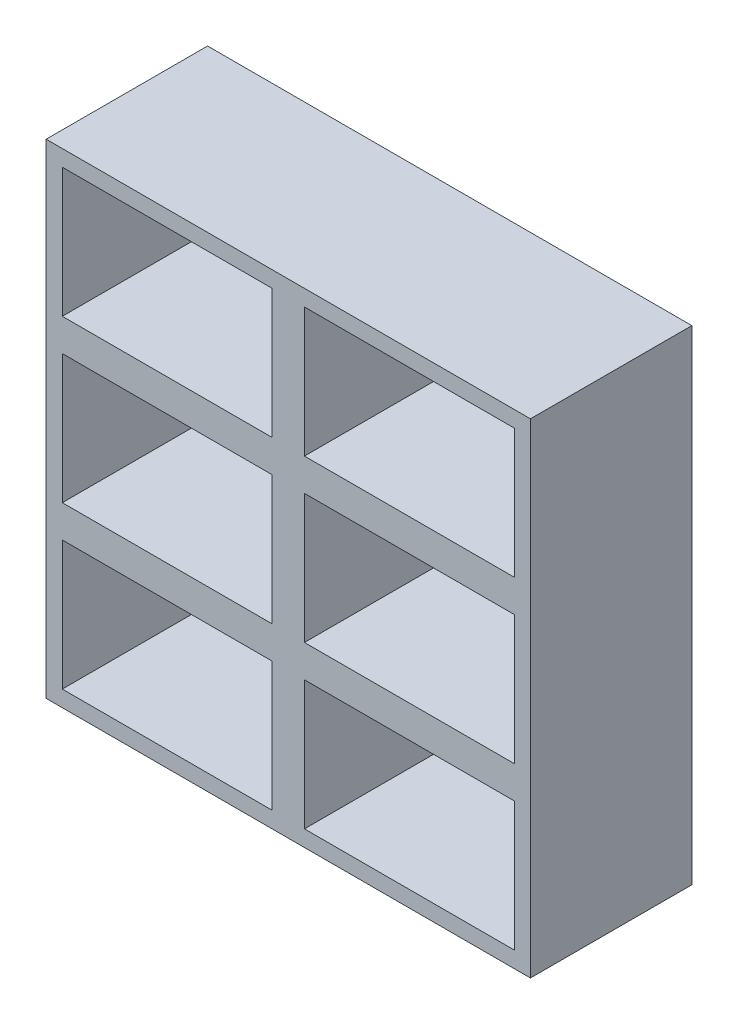
ISO-10303-21;
HEADER;
FILE_DESCRIPTION(('STEP AP214'),'2;1');
FILE_NAME('part.step','',(''),(''),'','','');
FILE_SCHEMA(('AUTOMOTIVE_DESIGN { 1 0 10303 214 1 1 1 1 }'));
ENDSEC;
DATA;
#1=APPLICATION_CONTEXT('core data for automotive mechanical design processes');
#2=APPLICATION_PROTOCOL_DEFINITION('international standard','automotive_design',2000,#1);
#3=PRODUCT_CONTEXT('',#1,'mechanical');
#4=PRODUCT('Part','Part','',(#3));
#5=PRODUCT_RELATED_PRODUCT_CATEGORY('part','',(#4));
#6=PRODUCT_DEFINITION_FORMATION('','',#4);
#7=PRODUCT_DEFINITION_CONTEXT('part definition',#1,'design');
#8=PRODUCT_DEFINITION('design','',#6,#7);
#9=PRODUCT_DEFINITION_SHAPE('','',#8);
#10=(LENGTH_UNIT() NAMED_UNIT(*) SI_UNIT(.MILLI.,.METRE.));
#11=(NAMED_UNIT(*) PLANE_ANGLE_UNIT() SI_UNIT($,.RADIAN.));
#12=(NAMED_UNIT(*) SI_UNIT($,.STERADIAN.) SOLID_ANGLE_UNIT());
#13=UNCERTAINTY_MEASURE_WITH_UNIT(LENGTH_MEASURE(1.E-05),#10,'distance_accuracy_value','');
#14=(GEOMETRIC_REPRESENTATION_CONTEXT(3) GLOBAL_UNCERTAINTY_ASSIGNED_CONTEXT((#13)) GLOBAL_UNIT_ASSIGNED_CONTEXT((#10,
#11,#12)) REPRESENTATION_CONTEXT('',''));
#15=CARTESIAN_POINT('',(0.,0.,0.));
#16=DIRECTION('',(0.,0.,1.));
#17=DIRECTION('',(1.,0.,0.));
#18=AXIS2_PLACEMENT_3D('',#15,#16,#17);
#19=CARTESIAN_POINT('',(0.,0.,-20.));
#20=DIRECTION('',(-1.,0.,0.));
#21=DIRECTION('',(0.,0.,1.));
#22=AXIS2_PLACEMENT_3D('',#19,#20,#21);
#23=PLANE('',#22);
#24=DIRECTION('',(0.,-1.,0.));
#25=VECTOR('',#24,1.);
#26=CARTESIAN_POINT('',(0.,0.,0.));
#27=LINE('',#26,#25);
#28=CARTESIAN_POINT('',(0.,60.,0.));
#29=VERTEX_POINT('',#28);
#30=CARTESIAN_POINT('',(0.,0.,0.));
#31=VERTEX_POINT('',#30);
#32=EDGE_CURVE('E412',#29,#31,#27,.T.);
#33=ORIENTED_EDGE('',*,*,#32,.F.);
#34=DIRECTION('',(0.,0.,1.));
#35=VECTOR('',#34,1.);
#36=CARTESIAN_POINT('',(0.,60.,-20.));
#37=LINE('',#36,#35);
#38=CARTESIAN_POINT('',(0.,60.,-20.));
#39=VERTEX_POINT('',#38);
#40=EDGE_CURVE('E11',#39,#29,#37,.T.);
#41=ORIENTED_EDGE('',*,*,#40,.F.);
#42=DIRECTION('',(0.,-1.,0.));
#43=VECTOR('',#42,1.);
#44=CARTESIAN_POINT('',(0.,0.,-20.));
#45=LINE('',#44,#43);
#46=CARTESIAN_POINT('',(0.,0.,-20.));
#47=VERTEX_POINT('',#46);
#48=EDGE_CURVE('E419',#39,#47,#45,.T.);
#49=ORIENTED_EDGE('',*,*,#48,.T.);
#50=DIRECTION('',(0.,0.,1.));
#51=VECTOR('',#50,1.);
#52=CARTESIAN_POINT('',(0.,0.,-20.));
#53=LINE('',#52,#51);
#54=EDGE_CURVE('E38',#47,#31,#53,.T.);
#55=ORIENTED_EDGE('',*,*,#54,.T.);
#56=EDGE_LOOP('',(#33,#41,#49,#55));
#57=FACE_BOUND('',#56,.T.);
#58=ADVANCED_FACE('F35',(#57),#23,.T.);
#59=CARTESIAN_POINT('',(0.,60.,-20.));
#60=DIRECTION('',(0.,1.,0.));
#61=DIRECTION('',(0.,0.,1.));
#62=AXIS2_PLACEMENT_3D('',#59,#60,#61);
#63=PLANE('',#62);
#64=DIRECTION('',(-1.,0.,0.));
#65=VECTOR('',#64,1.);
#66=CARTESIAN_POINT('',(0.,60.,0.));
#67=LINE('',#66,#65);
#68=CARTESIAN_POINT('',(60.,60.,0.));
#69=VERTEX_POINT('',#68);
#70=EDGE_CURVE('E423',#69,#29,#67,.T.);
#71=ORIENTED_EDGE('',*,*,#70,.F.);
#72=DIRECTION('',(0.,0.,1.));
#73=VECTOR('',#72,1.);
#74=CARTESIAN_POINT('',(60.,60.,-20.));
#75=LINE('',#74,#73);
#76=CARTESIAN_POINT('',(60.,60.,-20.));
#77=VERTEX_POINT('',#76);
#78=EDGE_CURVE('E43',#77,#69,#75,.T.);
#79=ORIENTED_EDGE('',*,*,#78,.F.);
#80=DIRECTION('',(-1.,0.,0.));
#81=VECTOR('',#80,1.);
#82=CARTESIAN_POINT('',(0.,60.,-20.));
#83=LINE('',#82,#81);
#84=EDGE_CURVE('E429',#77,#39,#83,.T.);
#85=ORIENTED_EDGE('',*,*,#84,.T.);
#86=ORIENTED_EDGE('',*,*,#40,.T.);
#87=EDGE_LOOP('',(#71,#79,#85,#86));
#88=FACE_BOUND('',#87,.T.);
#89=ADVANCED_FACE('F455',(#88),#63,.T.);
#90=CARTESIAN_POINT('',(60.,0.,-20.));
#91=DIRECTION('',(1.,0.,0.));
#92=DIRECTION('',(0.,0.,-1.));
#93=AXIS2_PLACEMENT_3D('',#90,#91,#92);
#94=PLANE('',#93);
#95=DIRECTION('',(0.,1.,0.));
#96=VECTOR('',#95,1.);
#97=CARTESIAN_POINT('',(60.,0.,0.));
#98=LINE('',#97,#96);
#99=CARTESIAN_POINT('',(60.,0.,0.));
#100=VERTEX_POINT('',#99);
#101=EDGE_CURVE('E437',#100,#69,#98,.T.);
#102=ORIENTED_EDGE('',*,*,#101,.F.);
#103=DIRECTION('',(0.,0.,1.));
#104=VECTOR('',#103,1.);
#105=CARTESIAN_POINT('',(60.,0.,-20.));
#106=LINE('',#105,#104);
#107=CARTESIAN_POINT('',(60.,0.,-20.));
#108=VERTEX_POINT('',#107);
#109=EDGE_CURVE('E442',#108,#100,#106,.T.);
#110=ORIENTED_EDGE('',*,*,#109,.F.);
#111=DIRECTION('',(0.,1.,0.));
#112=VECTOR('',#111,1.);
#113=CARTESIAN_POINT('',(60.,0.,-20.));
#114=LINE('',#113,#112);
#115=EDGE_CURVE('E426',#108,#77,#114,.T.);
#116=ORIENTED_EDGE('',*,*,#115,.T.);
#117=ORIENTED_EDGE('',*,*,#78,.T.);
#118=EDGE_LOOP('',(#102,#110,#116,#117));
#119=FACE_BOUND('',#118,.T.);
#120=ADVANCED_FACE('F461',(#119),#94,.T.);
#121=CARTESIAN_POINT('',(0.,0.,-20.));
#122=DIRECTION('',(0.,-1.,0.));
#123=DIRECTION('',(0.,0.,-1.));
#124=AXIS2_PLACEMENT_3D('',#121,#122,#123);
#125=PLANE('',#124);
#126=DIRECTION('',(1.,0.,0.));
#127=VECTOR('',#126,1.);
#128=CARTESIAN_POINT('',(0.,0.,0.));
#129=LINE('',#128,#127);
#130=EDGE_CURVE('E434',#31,#100,#129,.T.);
#131=ORIENTED_EDGE('',*,*,#130,.F.);
#132=ORIENTED_EDGE('',*,*,#54,.F.);
#133=DIRECTION('',(1.,0.,0.));
#134=VECTOR('',#133,1.);
#135=CARTESIAN_POINT('',(0.,0.,-20.));
#136=LINE('',#135,#134);
#137=EDGE_CURVE('E422',#47,#108,#136,.T.);
#138=ORIENTED_EDGE('',*,*,#137,.T.);
#139=ORIENTED_EDGE('',*,*,#109,.T.);
#140=EDGE_LOOP('',(#131,#132,#138,#139));
#141=FACE_BOUND('',#140,.T.);
#142=ADVANCED_FACE('F450',(#141),#125,.T.);
#143=CARTESIAN_POINT('',(0.,0.,-20.));
#144=DIRECTION('',(0.,0.,-1.));
#145=DIRECTION('',(-1.,0.,0.));
#146=AXIS2_PLACEMENT_3D('',#143,#144,#145);
#147=PLANE('',#146);
#148=ORIENTED_EDGE('',*,*,#48,.F.);
#149=ORIENTED_EDGE('',*,*,#84,.F.);
#150=ORIENTED_EDGE('',*,*,#115,.F.);
#151=ORIENTED_EDGE('',*,*,#137,.F.);
#152=EDGE_LOOP('',(#148,#149,#150,#151));
#153=FACE_BOUND('',#152,.T.);
#154=ADVANCED_FACE('F458',(#153),#147,.T.);
#155=CARTESIAN_POINT('',(0.,0.,0.));
#156=DIRECTION('',(0.,0.,-1.));
#157=DIRECTION('',(-1.,0.,0.));
#158=AXIS2_PLACEMENT_3D('',#155,#156,#157);
#159=PLANE('',#158);
#160=DIRECTION('',(0.,1.,0.));
#161=VECTOR('',#160,1.);
#162=CARTESIAN_POINT('',(28.,2.,0.));
#163=LINE('',#162,#161);
#164=CARTESIAN_POINT('',(28.,2.,0.));
#165=VERTEX_POINT('',#164);
#166=CARTESIAN_POINT('',(28.,18.,0.));
#167=VERTEX_POINT('',#166);
#168=EDGE_CURVE('E309',#165,#167,#163,.T.);
#169=ORIENTED_EDGE('',*,*,#168,.F.);
#170=DIRECTION('',(1.,0.,0.));
#171=VECTOR('',#170,1.);
#172=CARTESIAN_POINT('',(2.,2.,0.));
#173=LINE('',#172,#171);
#174=CARTESIAN_POINT('',(2.,2.,0.));
#175=VERTEX_POINT('',#174);
#176=EDGE_CURVE('E51',#175,#165,#173,.T.);
#177=ORIENTED_EDGE('',*,*,#176,.F.);
#178=DIRECTION('',(0.,-1.,0.));
#179=VECTOR('',#178,1.);
#180=CARTESIAN_POINT('',(2.,18.,0.));
#181=LINE('',#180,#179);
#182=CARTESIAN_POINT('',(2.,18.,0.));
#183=VERTEX_POINT('',#182);
#184=EDGE_CURVE('E298',#183,#175,#181,.T.);
#185=ORIENTED_EDGE('',*,*,#184,.F.);
#186=DIRECTION('',(-1.,0.,0.));
#187=VECTOR('',#186,1.);
#188=CARTESIAN_POINT('',(2.,18.,0.));
#189=LINE('',#188,#187);
#190=EDGE_CURVE('E312',#167,#183,#189,.T.);
#191=ORIENTED_EDGE('',*,*,#190,.F.);
#192=EDGE_LOOP('',(#169,#177,#185,#191));
#193=FACE_BOUND('',#192,.T.);
#194=DIRECTION('',(-1.,0.,0.));
#195=VECTOR('',#194,1.);
#196=CARTESIAN_POINT('',(58.,38.,0.));
#197=LINE('',#196,#195);
#198=CARTESIAN_POINT('',(58.,38.,0.));
#199=VERTEX_POINT('',#198);
#200=CARTESIAN_POINT('',(32.,38.,0.));
#201=VERTEX_POINT('',#200);
#202=EDGE_CURVE('E277',#199,#201,#197,.T.);
#203=ORIENTED_EDGE('',*,*,#202,.F.);
#204=DIRECTION('',(0.,1.,0.));
#205=VECTOR('',#204,1.);
#206=CARTESIAN_POINT('',(58.,22.,0.));
#207=LINE('',#206,#205);
#208=CARTESIAN_POINT('',(58.,22.,0.));
#209=VERTEX_POINT('',#208);
#210=EDGE_CURVE('E59',#209,#199,#207,.T.);
#211=ORIENTED_EDGE('',*,*,#210,.F.);
#212=DIRECTION('',(1.,0.,0.));
#213=VECTOR('',#212,1.);
#214=CARTESIAN_POINT('',(32.,22.,0.));
#215=LINE('',#214,#213);
#216=CARTESIAN_POINT('',(32.,22.,0.));
#217=VERTEX_POINT('',#216);
#218=EDGE_CURVE('E266',#217,#209,#215,.T.);
#219=ORIENTED_EDGE('',*,*,#218,.F.);
#220=DIRECTION('',(0.,-1.,0.));
#221=VECTOR('',#220,1.);
#222=CARTESIAN_POINT('',(32.,38.,0.));
#223=LINE('',#222,#221);
#224=EDGE_CURVE('E281',#201,#217,#223,.T.);
#225=ORIENTED_EDGE('',*,*,#224,.F.);
#226=EDGE_LOOP('',(#203,#211,#219,#225));
#227=FACE_BOUND('',#226,.T.);
#228=DIRECTION('',(0.,-1.,0.));
#229=VECTOR('',#228,1.);
#230=CARTESIAN_POINT('',(2.,38.,0.));
#231=LINE('',#230,#229);
#232=CARTESIAN_POINT('',(2.,38.,0.));
#233=VERTEX_POINT('',#232);
#234=CARTESIAN_POINT('',(2.,22.,0.));
#235=VERTEX_POINT('',#234);
#236=EDGE_CURVE('E372',#233,#235,#231,.T.);
#237=ORIENTED_EDGE('',*,*,#236,.F.);
#238=DIRECTION('',(-1.,0.,0.));
#239=VECTOR('',#238,1.);
#240=CARTESIAN_POINT('',(2.,38.,0.));
#241=LINE('',#240,#239);
#242=CARTESIAN_POINT('',(28.,38.,0.));
#243=VERTEX_POINT('',#242);
#244=EDGE_CURVE('E288',#243,#233,#241,.T.);
#245=ORIENTED_EDGE('',*,*,#244,.F.);
#246=DIRECTION('',(0.,1.,0.));
#247=VECTOR('',#246,1.);
#248=CARTESIAN_POINT('',(28.,38.,0.));
#249=LINE('',#248,#247);
#250=CARTESIAN_POINT('',(28.,22.,0.));
#251=VERTEX_POINT('',#250);
#252=EDGE_CURVE('E361',#251,#243,#249,.T.);
#253=ORIENTED_EDGE('',*,*,#252,.F.);
#254=DIRECTION('',(1.,0.,0.));
#255=VECTOR('',#254,1.);
#256=CARTESIAN_POINT('',(28.,22.,0.));
#257=LINE('',#256,#255);
#258=EDGE_CURVE('E375',#235,#251,#257,.T.);
#259=ORIENTED_EDGE('',*,*,#258,.F.);
#260=EDGE_LOOP('',(#237,#245,#253,#259));
#261=FACE_BOUND('',#260,.T.);
#262=DIRECTION('',(1.,0.,0.));
#263=VECTOR('',#262,1.);
#264=CARTESIAN_POINT('',(32.,42.,0.));
#265=LINE('',#264,#263);
#266=CARTESIAN_POINT('',(32.,42.,0.));
#267=VERTEX_POINT('',#266);
#268=CARTESIAN_POINT('',(58.,42.,0.));
#269=VERTEX_POINT('',#268);
#270=EDGE_CURVE('E339',#267,#269,#265,.T.);
#271=ORIENTED_EDGE('',*,*,#270,.F.);
#272=DIRECTION('',(0.,-1.,0.));
#273=VECTOR('',#272,1.);
#274=CARTESIAN_POINT('',(32.,58.,0.));
#275=LINE('',#274,#273);
#276=CARTESIAN_POINT('',(32.,58.,0.));
#277=VERTEX_POINT('',#276);
#278=EDGE_CURVE('E337',#277,#267,#275,.T.);
#279=ORIENTED_EDGE('',*,*,#278,.F.);
#280=DIRECTION('',(-1.,0.,0.));
#281=VECTOR('',#280,1.);
#282=CARTESIAN_POINT('',(32.,58.,0.));
#283=LINE('',#282,#281);
#284=CARTESIAN_POINT('',(58.,58.,0.));
#285=VERTEX_POINT('',#284);
#286=EDGE_CURVE('E327',#285,#277,#283,.T.);
#287=ORIENTED_EDGE('',*,*,#286,.F.);
#288=DIRECTION('',(0.,1.,0.));
#289=VECTOR('',#288,1.);
#290=CARTESIAN_POINT('',(58.,58.,0.));
#291=LINE('',#290,#289);
#292=EDGE_CURVE('E343',#269,#285,#291,.T.);
#293=ORIENTED_EDGE('',*,*,#292,.F.);
#294=EDGE_LOOP('',(#271,#279,#287,#293));
#295=FACE_BOUND('',#294,.T.);
#296=DIRECTION('',(1.,0.,0.));
#297=VECTOR('',#296,1.);
#298=CARTESIAN_POINT('',(32.,2.,0.));
#299=LINE('',#298,#297);
#300=CARTESIAN_POINT('',(32.,2.,0.));
#301=VERTEX_POINT('',#300);
#302=CARTESIAN_POINT('',(58.,2.,0.));
#303=VERTEX_POINT('',#302);
#304=EDGE_CURVE('E253',#301,#303,#299,.T.);
#305=ORIENTED_EDGE('',*,*,#304,.F.);
#306=DIRECTION('',(0.,-1.,0.));
#307=VECTOR('',#306,1.);
#308=CARTESIAN_POINT('',(32.,2.,0.));
#309=LINE('',#308,#307);
#310=CARTESIAN_POINT('',(32.,18.,0.));
#311=VERTEX_POINT('',#310);
#312=EDGE_CURVE('E227',#311,#301,#309,.T.);
#313=ORIENTED_EDGE('',*,*,#312,.F.);
#314=DIRECTION('',(-1.,0.,0.));
#315=VECTOR('',#314,1.);
#316=CARTESIAN_POINT('',(32.,18.,0.));
#317=LINE('',#316,#315);
#318=CARTESIAN_POINT('',(58.,18.,0.));
#319=VERTEX_POINT('',#318);
#320=EDGE_CURVE('E244',#319,#311,#317,.T.);
#321=ORIENTED_EDGE('',*,*,#320,.F.);
#322=DIRECTION('',(0.,1.,0.));
#323=VECTOR('',#322,1.);
#324=CARTESIAN_POINT('',(58.,2.,0.));
#325=LINE('',#324,#323);
#326=EDGE_CURVE('E247',#303,#319,#325,.T.);
#327=ORIENTED_EDGE('',*,*,#326,.F.);
#328=EDGE_LOOP('',(#305,#313,#321,#327));
#329=FACE_BOUND('',#328,.T.);
#330=DIRECTION('',(0.,-1.,0.));
#331=VECTOR('',#330,1.);
#332=CARTESIAN_POINT('',(2.,58.,0.));
#333=LINE('',#332,#331);
#334=CARTESIAN_POINT('',(2.,58.,0.));
#335=VERTEX_POINT('',#334);
#336=CARTESIAN_POINT('',(2.,42.,0.));
#337=VERTEX_POINT('',#336);
#338=EDGE_CURVE('E402',#335,#337,#333,.T.);
#339=ORIENTED_EDGE('',*,*,#338,.F.);
#340=DIRECTION('',(-1.,0.,0.));
#341=VECTOR('',#340,1.);
#342=CARTESIAN_POINT('',(2.,58.,0.));
#343=LINE('',#342,#341);
#344=CARTESIAN_POINT('',(28.,58.,0.));
#345=VERTEX_POINT('',#344);
#346=EDGE_CURVE('E350',#345,#335,#343,.T.);
#347=ORIENTED_EDGE('',*,*,#346,.F.);
#348=DIRECTION('',(0.,1.,0.));
#349=VECTOR('',#348,1.);
#350=CARTESIAN_POINT('',(28.,58.,0.));
#351=LINE('',#350,#349);
#352=CARTESIAN_POINT('',(28.,42.,0.));
#353=VERTEX_POINT('',#352);
#354=EDGE_CURVE('E391',#353,#345,#351,.T.);
#355=ORIENTED_EDGE('',*,*,#354,.F.);
#356=DIRECTION('',(1.,0.,0.));
#357=VECTOR('',#356,1.);
#358=CARTESIAN_POINT('',(28.,42.,0.));
#359=LINE('',#358,#357);
#360=EDGE_CURVE('E405',#337,#353,#359,.T.);
#361=ORIENTED_EDGE('',*,*,#360,.F.);
#362=EDGE_LOOP('',(#339,#347,#355,#361));
#363=FACE_BOUND('',#362,.T.);
#364=ORIENTED_EDGE('',*,*,#32,.T.);
#365=ORIENTED_EDGE('',*,*,#130,.T.);
#366=ORIENTED_EDGE('',*,*,#101,.T.);
#367=ORIENTED_EDGE('',*,*,#70,.T.);
#368=EDGE_LOOP('',(#364,#365,#366,#367));
#369=FACE_BOUND('',#368,.T.);
#370=ADVANCED_FACE('F452',(#193,#227,#261,#295,#329,#363,#369),#159,.F.);
#371=CARTESIAN_POINT('',(2.,58.,-18.));
#372=DIRECTION('',(0.,1.,0.));
#373=DIRECTION('',(-1.,0.,0.));
#374=AXIS2_PLACEMENT_3D('',#371,#372,#373);
#375=PLANE('',#374);
#376=ORIENTED_EDGE('',*,*,#346,.T.);
#377=DIRECTION('',(0.,0.,1.));
#378=VECTOR('',#377,1.);
#379=CARTESIAN_POINT('',(2.,58.,-18.));
#380=LINE('',#379,#378);
#381=CARTESIAN_POINT('',(2.,58.,-18.));
#382=VERTEX_POINT('',#381);
#383=EDGE_CURVE('E400',#382,#335,#380,.T.);
#384=ORIENTED_EDGE('',*,*,#383,.F.);
#385=DIRECTION('',(-1.,0.,0.));
#386=VECTOR('',#385,1.);
#387=CARTESIAN_POINT('',(2.,58.,-18.));
#388=LINE('',#387,#386);
#389=CARTESIAN_POINT('',(28.,58.,-18.));
#390=VERTEX_POINT('',#389);
#391=EDGE_CURVE('E387',#390,#382,#388,.T.);
#392=ORIENTED_EDGE('',*,*,#391,.F.);
#393=DIRECTION('',(0.,0.,1.));
#394=VECTOR('',#393,1.);
#395=CARTESIAN_POINT('',(28.,58.,-18.));
#396=LINE('',#395,#394);
#397=EDGE_CURVE('E410',#390,#345,#396,.T.);
#398=ORIENTED_EDGE('',*,*,#397,.T.);
#399=EDGE_LOOP('',(#376,#384,#392,#398));
#400=FACE_BOUND('',#399,.T.);
#401=ADVANCED_FACE('F503',(#400),#375,.F.);
#402=CARTESIAN_POINT('',(28.,58.,-18.));
#403=DIRECTION('',(1.,0.,0.));
#404=DIRECTION('',(0.,1.,0.));
#405=AXIS2_PLACEMENT_3D('',#402,#403,#404);
#406=PLANE('',#405);
#407=ORIENTED_EDGE('',*,*,#354,.T.);
#408=ORIENTED_EDGE('',*,*,#397,.F.);
#409=DIRECTION('',(0.,1.,0.));
#410=VECTOR('',#409,1.);
#411=CARTESIAN_POINT('',(28.,58.,-18.));
#412=LINE('',#411,#410);
#413=CARTESIAN_POINT('',(28.,42.,-18.));
#414=VERTEX_POINT('',#413);
#415=EDGE_CURVE('E397',#414,#390,#412,.T.);
#416=ORIENTED_EDGE('',*,*,#415,.F.);
#417=DIRECTION('',(0.,0.,1.));
#418=VECTOR('',#417,1.);
#419=CARTESIAN_POINT('',(28.,42.,-18.));
#420=LINE('',#419,#418);
#421=EDGE_CURVE('E413',#414,#353,#420,.T.);
#422=ORIENTED_EDGE('',*,*,#421,.T.);
#423=EDGE_LOOP('',(#407,#408,#416,#422));
#424=FACE_BOUND('',#423,.T.);
#425=ADVANCED_FACE('F513',(#424),#406,.F.);
#426=CARTESIAN_POINT('',(28.,42.,-18.));
#427=DIRECTION('',(0.,-1.,0.));
#428=DIRECTION('',(1.,0.,0.));
#429=AXIS2_PLACEMENT_3D('',#426,#427,#428);
#430=PLANE('',#429);
#431=ORIENTED_EDGE('',*,*,#360,.T.);
#432=ORIENTED_EDGE('',*,*,#421,.F.);
#433=DIRECTION('',(1.,0.,0.));
#434=VECTOR('',#433,1.);
#435=CARTESIAN_POINT('',(28.,42.,-18.));
#436=LINE('',#435,#434);
#437=CARTESIAN_POINT('',(2.,42.,-18.));
#438=VERTEX_POINT('',#437);
#439=EDGE_CURVE('E394',#438,#414,#436,.T.);
#440=ORIENTED_EDGE('',*,*,#439,.F.);
#441=DIRECTION('',(0.,0.,1.));
#442=VECTOR('',#441,1.);
#443=CARTESIAN_POINT('',(2.,42.,-18.));
#444=LINE('',#443,#442);
#445=EDGE_CURVE('E415',#438,#337,#444,.T.);
#446=ORIENTED_EDGE('',*,*,#445,.T.);
#447=EDGE_LOOP('',(#431,#432,#440,#446));
#448=FACE_BOUND('',#447,.T.);
#449=ADVANCED_FACE('F523',(#448),#430,.F.);
#450=CARTESIAN_POINT('',(2.,58.,-18.));
#451=DIRECTION('',(-1.,0.,0.));
#452=DIRECTION('',(0.,-1.,0.));
#453=AXIS2_PLACEMENT_3D('',#450,#451,#452);
#454=PLANE('',#453);
#455=ORIENTED_EDGE('',*,*,#338,.T.);
#456=ORIENTED_EDGE('',*,*,#445,.F.);
#457=DIRECTION('',(0.,-1.,0.));
#458=VECTOR('',#457,1.);
#459=CARTESIAN_POINT('',(2.,58.,-18.));
#460=LINE('',#459,#458);
#461=EDGE_CURVE('E390',#382,#438,#460,.T.);
#462=ORIENTED_EDGE('',*,*,#461,.F.);
#463=ORIENTED_EDGE('',*,*,#383,.T.);
#464=EDGE_LOOP('',(#455,#456,#462,#463));
#465=FACE_BOUND('',#464,.T.);
#466=ADVANCED_FACE('F533',(#465),#454,.F.);
#467=CARTESIAN_POINT('',(0.,0.,-18.));
#468=DIRECTION('',(0.,0.,-1.));
#469=DIRECTION('',(-1.,0.,0.));
#470=AXIS2_PLACEMENT_3D('',#467,#468,#469);
#471=PLANE('',#470);
#472=ORIENTED_EDGE('',*,*,#391,.T.);
#473=ORIENTED_EDGE('',*,*,#461,.T.);
#474=ORIENTED_EDGE('',*,*,#439,.T.);
#475=ORIENTED_EDGE('',*,*,#415,.T.);
#476=EDGE_LOOP('',(#472,#473,#474,#475));
#477=FACE_BOUND('',#476,.T.);
#478=ADVANCED_FACE('F543',(#477),#471,.F.);
#479=CARTESIAN_POINT('',(32.,2.,-18.));
#480=DIRECTION('',(-1.,0.,0.));
#481=DIRECTION('',(0.,0.,1.));
#482=AXIS2_PLACEMENT_3D('',#479,#480,#481);
#483=PLANE('',#482);
#484=ORIENTED_EDGE('',*,*,#312,.T.);
#485=DIRECTION('',(0.,0.,1.));
#486=VECTOR('',#485,1.);
#487=CARTESIAN_POINT('',(32.,2.,-18.));
#488=LINE('',#487,#486);
#489=CARTESIAN_POINT('',(32.,2.,-18.));
#490=VERTEX_POINT('',#489);
#491=EDGE_CURVE('E220',#490,#301,#488,.T.);
#492=ORIENTED_EDGE('',*,*,#491,.F.);
#493=DIRECTION('',(0.,-1.,0.));
#494=VECTOR('',#493,1.);
#495=CARTESIAN_POINT('',(32.,2.,-18.));
#496=LINE('',#495,#494);
#497=CARTESIAN_POINT('',(32.,18.,-18.));
#498=VERTEX_POINT('',#497);
#499=EDGE_CURVE('E224',#498,#490,#496,.T.);
#500=ORIENTED_EDGE('',*,*,#499,.F.);
#501=DIRECTION('',(0.,0.,1.));
#502=VECTOR('',#501,1.);
#503=CARTESIAN_POINT('',(32.,18.,-18.));
#504=LINE('',#503,#502);
#505=EDGE_CURVE('E257',#498,#311,#504,.T.);
#506=ORIENTED_EDGE('',*,*,#505,.T.);
#507=EDGE_LOOP('',(#484,#492,#500,#506));
#508=FACE_BOUND('',#507,.T.);
#509=ADVANCED_FACE('F222',(#508),#483,.F.);
#510=CARTESIAN_POINT('',(32.,18.,-18.));
#511=DIRECTION('',(0.,1.,0.));
#512=DIRECTION('',(0.,0.,1.));
#513=AXIS2_PLACEMENT_3D('',#510,#511,#512);
#514=PLANE('',#513);
#515=ORIENTED_EDGE('',*,*,#320,.T.);
#516=ORIENTED_EDGE('',*,*,#505,.F.);
#517=DIRECTION('',(-1.,0.,0.));
#518=VECTOR('',#517,1.);
#519=CARTESIAN_POINT('',(32.,18.,-18.));
#520=LINE('',#519,#518);
#521=CARTESIAN_POINT('',(58.,18.,-18.));
#522=VERTEX_POINT('',#521);
#523=EDGE_CURVE('E232',#522,#498,#520,.T.);
#524=ORIENTED_EDGE('',*,*,#523,.F.);
#525=DIRECTION('',(0.,0.,1.));
#526=VECTOR('',#525,1.);
#527=CARTESIAN_POINT('',(58.,18.,-18.));
#528=LINE('',#527,#526);
#529=EDGE_CURVE('E259',#522,#319,#528,.T.);
#530=ORIENTED_EDGE('',*,*,#529,.T.);
#531=EDGE_LOOP('',(#515,#516,#524,#530));
#532=FACE_BOUND('',#531,.T.);
#533=ADVANCED_FACE('F562',(#532),#514,.F.);
#534=CARTESIAN_POINT('',(58.,2.,-18.));
#535=DIRECTION('',(1.,0.,0.));
#536=DIRECTION('',(0.,0.,-1.));
#537=AXIS2_PLACEMENT_3D('',#534,#535,#536);
#538=PLANE('',#537);
#539=ORIENTED_EDGE('',*,*,#326,.T.);
#540=ORIENTED_EDGE('',*,*,#529,.F.);
#541=DIRECTION('',(0.,1.,0.));
#542=VECTOR('',#541,1.);
#543=CARTESIAN_POINT('',(58.,2.,-18.));
#544=LINE('',#543,#542);
#545=CARTESIAN_POINT('',(58.,2.,-18.));
#546=VERTEX_POINT('',#545);
#547=EDGE_CURVE('E240',#546,#522,#544,.T.);
#548=ORIENTED_EDGE('',*,*,#547,.F.);
#549=DIRECTION('',(0.,0.,1.));
#550=VECTOR('',#549,1.);
#551=CARTESIAN_POINT('',(58.,2.,-18.));
#552=LINE('',#551,#550);
#553=EDGE_CURVE('E231',#546,#303,#552,.T.);
#554=ORIENTED_EDGE('',*,*,#553,.T.);
#555=EDGE_LOOP('',(#539,#540,#548,#554));
#556=FACE_BOUND('',#555,.T.);
#557=ADVANCED_FACE('F571',(#556),#538,.F.);
#558=CARTESIAN_POINT('',(32.,2.,-18.));
#559=DIRECTION('',(0.,-1.,0.));
#560=DIRECTION('',(0.,0.,-1.));
#561=AXIS2_PLACEMENT_3D('',#558,#559,#560);
#562=PLANE('',#561);
#563=ORIENTED_EDGE('',*,*,#304,.T.);
#564=ORIENTED_EDGE('',*,*,#553,.F.);
#565=DIRECTION('',(1.,0.,0.));
#566=VECTOR('',#565,1.);
#567=CARTESIAN_POINT('',(32.,2.,-18.));
#568=LINE('',#567,#566);
#569=EDGE_CURVE('E235',#490,#546,#568,.T.);
#570=ORIENTED_EDGE('',*,*,#569,.F.);
#571=ORIENTED_EDGE('',*,*,#491,.T.);
#572=EDGE_LOOP('',(#563,#564,#570,#571));
#573=FACE_BOUND('',#572,.T.);
#574=ADVANCED_FACE('F236',(#573),#562,.F.);
#575=CARTESIAN_POINT('',(0.,0.,-18.));
#576=DIRECTION('',(0.,0.,-1.));
#577=DIRECTION('',(-1.,0.,0.));
#578=AXIS2_PLACEMENT_3D('',#575,#576,#577);
#579=PLANE('',#578);
#580=ORIENTED_EDGE('',*,*,#499,.T.);
#581=ORIENTED_EDGE('',*,*,#569,.T.);
#582=ORIENTED_EDGE('',*,*,#547,.T.);
#583=ORIENTED_EDGE('',*,*,#523,.T.);
#584=EDGE_LOOP('',(#580,#581,#582,#583));
#585=FACE_BOUND('',#584,.T.);
#586=ADVANCED_FACE('F242',(#585),#579,.F.);
#587=CARTESIAN_POINT('',(32.,58.,-18.));
#588=DIRECTION('',(-1.,0.,0.));
#589=DIRECTION('',(0.,0.,1.));
#590=AXIS2_PLACEMENT_3D('',#587,#588,#589);
#591=PLANE('',#590);
#592=ORIENTED_EDGE('',*,*,#278,.T.);
#593=DIRECTION('',(0.,0.,1.));
#594=VECTOR('',#593,1.);
#595=CARTESIAN_POINT('',(32.,42.,-18.));
#596=LINE('',#595,#594);
#597=CARTESIAN_POINT('',(32.,42.,-18.));
#598=VERTEX_POINT('',#597);
#599=EDGE_CURVE('E336',#598,#267,#596,.T.);
#600=ORIENTED_EDGE('',*,*,#599,.F.);
#601=DIRECTION('',(0.,-1.,0.));
#602=VECTOR('',#601,1.);
#603=CARTESIAN_POINT('',(32.,58.,-18.));
#604=LINE('',#603,#602);
#605=CARTESIAN_POINT('',(32.,58.,-18.));
#606=VERTEX_POINT('',#605);
#607=EDGE_CURVE('E323',#606,#598,#604,.T.);
#608=ORIENTED_EDGE('',*,*,#607,.F.);
#609=DIRECTION('',(0.,0.,1.));
#610=VECTOR('',#609,1.);
#611=CARTESIAN_POINT('',(32.,58.,-18.));
#612=LINE('',#611,#610);
#613=EDGE_CURVE('E348',#606,#277,#612,.T.);
#614=ORIENTED_EDGE('',*,*,#613,.T.);
#615=EDGE_LOOP('',(#592,#600,#608,#614));
#616=FACE_BOUND('',#615,.T.);
#617=ADVANCED_FACE('F598',(#616),#591,.F.);
#618=CARTESIAN_POINT('',(32.,58.,-18.));
#619=DIRECTION('',(0.,1.,0.));
#620=DIRECTION('',(0.,0.,1.));
#621=AXIS2_PLACEMENT_3D('',#618,#619,#620);
#622=PLANE('',#621);
#623=ORIENTED_EDGE('',*,*,#286,.T.);
#624=ORIENTED_EDGE('',*,*,#613,.F.);
#625=DIRECTION('',(-1.,0.,0.));
#626=VECTOR('',#625,1.);
#627=CARTESIAN_POINT('',(32.,58.,-18.));
#628=LINE('',#627,#626);
#629=CARTESIAN_POINT('',(58.,58.,-18.));
#630=VERTEX_POINT('',#629);
#631=EDGE_CURVE('E333',#630,#606,#628,.T.);
#632=ORIENTED_EDGE('',*,*,#631,.F.);
#633=DIRECTION('',(0.,0.,1.));
#634=VECTOR('',#633,1.);
#635=CARTESIAN_POINT('',(58.,58.,-18.));
#636=LINE('',#635,#634);
#637=EDGE_CURVE('E351',#630,#285,#636,.T.);
#638=ORIENTED_EDGE('',*,*,#637,.T.);
#639=EDGE_LOOP('',(#623,#624,#632,#638));
#640=FACE_BOUND('',#639,.T.);
#641=ADVANCED_FACE('F607',(#640),#622,.F.);
#642=CARTESIAN_POINT('',(58.,58.,-18.));
#643=DIRECTION('',(1.,0.,0.));
#644=DIRECTION('',(0.,0.,-1.));
#645=AXIS2_PLACEMENT_3D('',#642,#643,#644);
#646=PLANE('',#645);
#647=ORIENTED_EDGE('',*,*,#292,.T.);
#648=ORIENTED_EDGE('',*,*,#637,.F.);
#649=DIRECTION('',(0.,1.,0.));
#650=VECTOR('',#649,1.);
#651=CARTESIAN_POINT('',(58.,58.,-18.));
#652=LINE('',#651,#650);
#653=CARTESIAN_POINT('',(58.,42.,-18.));
#654=VERTEX_POINT('',#653);
#655=EDGE_CURVE('E330',#654,#630,#652,.T.);
#656=ORIENTED_EDGE('',*,*,#655,.F.);
#657=DIRECTION('',(0.,0.,1.));
#658=VECTOR('',#657,1.);
#659=CARTESIAN_POINT('',(58.,42.,-18.));
#660=LINE('',#659,#658);
#661=EDGE_CURVE('E353',#654,#269,#660,.T.);
#662=ORIENTED_EDGE('',*,*,#661,.T.);
#663=EDGE_LOOP('',(#647,#648,#656,#662));
#664=FACE_BOUND('',#663,.T.);
#665=ADVANCED_FACE('F617',(#664),#646,.F.);
#666=CARTESIAN_POINT('',(32.,42.,-18.));
#667=DIRECTION('',(0.,-1.,0.));
#668=DIRECTION('',(0.,0.,-1.));
#669=AXIS2_PLACEMENT_3D('',#666,#667,#668);
#670=PLANE('',#669);
#671=ORIENTED_EDGE('',*,*,#270,.T.);
#672=ORIENTED_EDGE('',*,*,#661,.F.);
#673=DIRECTION('',(1.,0.,0.));
#674=VECTOR('',#673,1.);
#675=CARTESIAN_POINT('',(32.,42.,-18.));
#676=LINE('',#675,#674);
#677=EDGE_CURVE('E326',#598,#654,#676,.T.);
#678=ORIENTED_EDGE('',*,*,#677,.F.);
#679=ORIENTED_EDGE('',*,*,#599,.T.);
#680=EDGE_LOOP('',(#671,#672,#678,#679));
#681=FACE_BOUND('',#680,.T.);
#682=ADVANCED_FACE('F627',(#681),#670,.F.);
#683=CARTESIAN_POINT('',(0.,0.,-18.));
#684=DIRECTION('',(0.,0.,1.));
#685=DIRECTION('',(1.,0.,0.));
#686=AXIS2_PLACEMENT_3D('',#683,#684,#685);
#687=PLANE('',#686);
#688=ORIENTED_EDGE('',*,*,#607,.T.);
#689=ORIENTED_EDGE('',*,*,#677,.T.);
#690=ORIENTED_EDGE('',*,*,#655,.T.);
#691=ORIENTED_EDGE('',*,*,#631,.T.);
#692=EDGE_LOOP('',(#688,#689,#690,#691));
#693=FACE_BOUND('',#692,.T.);
#694=ADVANCED_FACE('F637',(#693),#687,.T.);
#695=CARTESIAN_POINT('',(2.,38.,-18.));
#696=DIRECTION('',(0.,1.,0.));
#697=DIRECTION('',(0.,0.,1.));
#698=AXIS2_PLACEMENT_3D('',#695,#696,#697);
#699=PLANE('',#698);
#700=ORIENTED_EDGE('',*,*,#244,.T.);
#701=DIRECTION('',(0.,0.,1.));
#702=VECTOR('',#701,1.);
#703=CARTESIAN_POINT('',(2.,38.,-18.));
#704=LINE('',#703,#702);
#705=CARTESIAN_POINT('',(2.,38.,-18.));
#706=VERTEX_POINT('',#705);
#707=EDGE_CURVE('E370',#706,#233,#704,.T.);
#708=ORIENTED_EDGE('',*,*,#707,.F.);
#709=DIRECTION('',(-1.,0.,0.));
#710=VECTOR('',#709,1.);
#711=CARTESIAN_POINT('',(2.,38.,-18.));
#712=LINE('',#711,#710);
#713=CARTESIAN_POINT('',(28.,38.,-18.));
#714=VERTEX_POINT('',#713);
#715=EDGE_CURVE('E357',#714,#706,#712,.T.);
#716=ORIENTED_EDGE('',*,*,#715,.F.);
#717=DIRECTION('',(0.,0.,1.));
#718=VECTOR('',#717,1.);
#719=CARTESIAN_POINT('',(28.,38.,-18.));
#720=LINE('',#719,#718);
#721=EDGE_CURVE('E340',#714,#243,#720,.T.);
#722=ORIENTED_EDGE('',*,*,#721,.T.);
#723=EDGE_LOOP('',(#700,#708,#716,#722));
#724=FACE_BOUND('',#723,.T.);
#725=ADVANCED_FACE('F647',(#724),#699,.F.);
#726=CARTESIAN_POINT('',(28.,38.,-18.));
#727=DIRECTION('',(1.,0.,0.));
#728=DIRECTION('',(0.,1.,0.));
#729=AXIS2_PLACEMENT_3D('',#726,#727,#728);
#730=PLANE('',#729);
#731=ORIENTED_EDGE('',*,*,#252,.T.);
#732=ORIENTED_EDGE('',*,*,#721,.F.);
#733=DIRECTION('',(0.,1.,0.));
#734=VECTOR('',#733,1.);
#735=CARTESIAN_POINT('',(28.,38.,-18.));
#736=LINE('',#735,#734);
#737=CARTESIAN_POINT('',(28.,22.,-18.));
#738=VERTEX_POINT('',#737);
#739=EDGE_CURVE('E367',#738,#714,#736,.T.);
#740=ORIENTED_EDGE('',*,*,#739,.F.);
#741=DIRECTION('',(0.,0.,1.));
#742=VECTOR('',#741,1.);
#743=CARTESIAN_POINT('',(28.,22.,-18.));
#744=LINE('',#743,#742);
#745=EDGE_CURVE('E381',#738,#251,#744,.T.);
#746=ORIENTED_EDGE('',*,*,#745,.T.);
#747=EDGE_LOOP('',(#731,#732,#740,#746));
#748=FACE_BOUND('',#747,.T.);
#749=ADVANCED_FACE('F657',(#748),#730,.F.);
#750=CARTESIAN_POINT('',(28.,22.,-18.));
#751=DIRECTION('',(0.,-1.,0.));
#752=DIRECTION('',(1.,0.,0.));
#753=AXIS2_PLACEMENT_3D('',#750,#751,#752);
#754=PLANE('',#753);
#755=ORIENTED_EDGE('',*,*,#258,.T.);
#756=ORIENTED_EDGE('',*,*,#745,.F.);
#757=DIRECTION('',(1.,0.,0.));
#758=VECTOR('',#757,1.);
#759=CARTESIAN_POINT('',(28.,22.,-18.));
#760=LINE('',#759,#758);
#761=CARTESIAN_POINT('',(2.,22.,-18.));
#762=VERTEX_POINT('',#761);
#763=EDGE_CURVE('E364',#762,#738,#760,.T.);
#764=ORIENTED_EDGE('',*,*,#763,.F.);
#765=DIRECTION('',(0.,0.,1.));
#766=VECTOR('',#765,1.);
#767=CARTESIAN_POINT('',(2.,22.,-18.));
#768=LINE('',#767,#766);
#769=EDGE_CURVE('E383',#762,#235,#768,.T.);
#770=ORIENTED_EDGE('',*,*,#769,.T.);
#771=EDGE_LOOP('',(#755,#756,#764,#770));
#772=FACE_BOUND('',#771,.T.);
#773=ADVANCED_FACE('F667',(#772),#754,.F.);
#774=CARTESIAN_POINT('',(2.,38.,-18.));
#775=DIRECTION('',(-1.,0.,0.));
#776=DIRECTION('',(0.,-1.,0.));
#777=AXIS2_PLACEMENT_3D('',#774,#775,#776);
#778=PLANE('',#777);
#779=ORIENTED_EDGE('',*,*,#236,.T.);
#780=ORIENTED_EDGE('',*,*,#769,.F.);
#781=DIRECTION('',(0.,-1.,0.));
#782=VECTOR('',#781,1.);
#783=CARTESIAN_POINT('',(2.,38.,-18.));
#784=LINE('',#783,#782);
#785=EDGE_CURVE('E360',#706,#762,#784,.T.);
#786=ORIENTED_EDGE('',*,*,#785,.F.);
#787=ORIENTED_EDGE('',*,*,#707,.T.);
#788=EDGE_LOOP('',(#779,#780,#786,#787));
#789=FACE_BOUND('',#788,.T.);
#790=ADVANCED_FACE('F677',(#789),#778,.F.);
#791=CARTESIAN_POINT('',(0.,0.,-18.));
#792=DIRECTION('',(0.,0.,-1.));
#793=DIRECTION('',(-1.,0.,0.));
#794=AXIS2_PLACEMENT_3D('',#791,#792,#793);
#795=PLANE('',#794);
#796=ORIENTED_EDGE('',*,*,#715,.T.);
#797=ORIENTED_EDGE('',*,*,#785,.T.);
#798=ORIENTED_EDGE('',*,*,#763,.T.);
#799=ORIENTED_EDGE('',*,*,#739,.T.);
#800=EDGE_LOOP('',(#796,#797,#798,#799));
#801=FACE_BOUND('',#800,.T.);
#802=ADVANCED_FACE('F687',(#801),#795,.F.);
#803=CARTESIAN_POINT('',(58.,22.,-18.));
#804=DIRECTION('',(1.,0.,0.));
#805=DIRECTION('',(0.,0.,-1.));
#806=AXIS2_PLACEMENT_3D('',#803,#804,#805);
#807=PLANE('',#806);
#808=ORIENTED_EDGE('',*,*,#210,.T.);
#809=DIRECTION('',(0.,0.,1.));
#810=VECTOR('',#809,1.);
#811=CARTESIAN_POINT('',(58.,38.,-18.));
#812=LINE('',#811,#810);
#813=CARTESIAN_POINT('',(58.,38.,-18.));
#814=VERTEX_POINT('',#813);
#815=EDGE_CURVE('E275',#814,#199,#812,.T.);
#816=ORIENTED_EDGE('',*,*,#815,.F.);
#817=DIRECTION('',(0.,1.,0.));
#818=VECTOR('',#817,1.);
#819=CARTESIAN_POINT('',(58.,22.,-18.));
#820=LINE('',#819,#818);
#821=CARTESIAN_POINT('',(58.,22.,-18.));
#822=VERTEX_POINT('',#821);
#823=EDGE_CURVE('E262',#822,#814,#820,.T.);
#824=ORIENTED_EDGE('',*,*,#823,.F.);
#825=DIRECTION('',(0.,0.,1.));
#826=VECTOR('',#825,1.);
#827=CARTESIAN_POINT('',(58.,22.,-18.));
#828=LINE('',#827,#826);
#829=EDGE_CURVE('E286',#822,#209,#828,.T.);
#830=ORIENTED_EDGE('',*,*,#829,.T.);
#831=EDGE_LOOP('',(#808,#816,#824,#830));
#832=FACE_BOUND('',#831,.T.);
#833=ADVANCED_FACE('F697',(#832),#807,.F.);
#834=CARTESIAN_POINT('',(32.,22.,-18.));
#835=DIRECTION('',(0.,-1.,0.));
#836=DIRECTION('',(0.,0.,-1.));
#837=AXIS2_PLACEMENT_3D('',#834,#835,#836);
#838=PLANE('',#837);
#839=ORIENTED_EDGE('',*,*,#218,.T.);
#840=ORIENTED_EDGE('',*,*,#829,.F.);
#841=DIRECTION('',(1.,0.,0.));
#842=VECTOR('',#841,1.);
#843=CARTESIAN_POINT('',(32.,22.,-18.));
#844=LINE('',#843,#842);
#845=CARTESIAN_POINT('',(32.,22.,-18.));
#846=VERTEX_POINT('',#845);
#847=EDGE_CURVE('E272',#846,#822,#844,.T.);
#848=ORIENTED_EDGE('',*,*,#847,.F.);
#849=DIRECTION('',(0.,0.,1.));
#850=VECTOR('',#849,1.);
#851=CARTESIAN_POINT('',(32.,22.,-18.));
#852=LINE('',#851,#850);
#853=EDGE_CURVE('E289',#846,#217,#852,.T.);
#854=ORIENTED_EDGE('',*,*,#853,.T.);
#855=EDGE_LOOP('',(#839,#840,#848,#854));
#856=FACE_BOUND('',#855,.T.);
#857=ADVANCED_FACE('F707',(#856),#838,.F.);
#858=CARTESIAN_POINT('',(32.,38.,-18.));
#859=DIRECTION('',(-1.,0.,0.));
#860=DIRECTION('',(0.,0.,1.));
#861=AXIS2_PLACEMENT_3D('',#858,#859,#860);
#862=PLANE('',#861);
#863=ORIENTED_EDGE('',*,*,#224,.T.);
#864=ORIENTED_EDGE('',*,*,#853,.F.);
#865=DIRECTION('',(0.,-1.,0.));
#866=VECTOR('',#865,1.);
#867=CARTESIAN_POINT('',(32.,38.,-18.));
#868=LINE('',#867,#866);
#869=CARTESIAN_POINT('',(32.,38.,-18.));
#870=VERTEX_POINT('',#869);
#871=EDGE_CURVE('E269',#870,#846,#868,.T.);
#872=ORIENTED_EDGE('',*,*,#871,.F.);
#873=DIRECTION('',(0.,0.,1.));
#874=VECTOR('',#873,1.);
#875=CARTESIAN_POINT('',(32.,38.,-18.));
#876=LINE('',#875,#874);
#877=EDGE_CURVE('E291',#870,#201,#876,.T.);
#878=ORIENTED_EDGE('',*,*,#877,.T.);
#879=EDGE_LOOP('',(#863,#864,#872,#878));
#880=FACE_BOUND('',#879,.T.);
#881=ADVANCED_FACE('F716',(#880),#862,.F.);
#882=CARTESIAN_POINT('',(58.,38.,-18.));
#883=DIRECTION('',(0.,1.,0.));
#884=DIRECTION('',(0.,0.,1.));
#885=AXIS2_PLACEMENT_3D('',#882,#883,#884);
#886=PLANE('',#885);
#887=ORIENTED_EDGE('',*,*,#202,.T.);
#888=ORIENTED_EDGE('',*,*,#877,.F.);
#889=DIRECTION('',(-1.,0.,0.));
#890=VECTOR('',#889,1.);
#891=CARTESIAN_POINT('',(58.,38.,-18.));
#892=LINE('',#891,#890);
#893=EDGE_CURVE('E265',#814,#870,#892,.T.);
#894=ORIENTED_EDGE('',*,*,#893,.F.);
#895=ORIENTED_EDGE('',*,*,#815,.T.);
#896=EDGE_LOOP('',(#887,#888,#894,#895));
#897=FACE_BOUND('',#896,.T.);
#898=ADVANCED_FACE('F726',(#897),#886,.F.);
#899=CARTESIAN_POINT('',(0.,0.,-18.));
#900=DIRECTION('',(0.,0.,1.));
#901=DIRECTION('',(1.,0.,0.));
#902=AXIS2_PLACEMENT_3D('',#899,#900,#901);
#903=PLANE('',#902);
#904=ORIENTED_EDGE('',*,*,#823,.T.);
#905=ORIENTED_EDGE('',*,*,#893,.T.);
#906=ORIENTED_EDGE('',*,*,#871,.T.);
#907=ORIENTED_EDGE('',*,*,#847,.T.);
#908=EDGE_LOOP('',(#904,#905,#906,#907));
#909=FACE_BOUND('',#908,.T.);
#910=ADVANCED_FACE('F736',(#909),#903,.T.);
#911=CARTESIAN_POINT('',(2.,2.,-18.));
#912=DIRECTION('',(0.,-1.,0.));
#913=DIRECTION('',(0.,0.,-1.));
#914=AXIS2_PLACEMENT_3D('',#911,#912,#913);
#915=PLANE('',#914);
#916=ORIENTED_EDGE('',*,*,#176,.T.);
#917=DIRECTION('',(0.,0.,1.));
#918=VECTOR('',#917,1.);
#919=CARTESIAN_POINT('',(28.,2.,-18.));
#920=LINE('',#919,#918);
#921=CARTESIAN_POINT('',(28.,2.,-18.));
#922=VERTEX_POINT('',#921);
#923=EDGE_CURVE('E307',#922,#165,#920,.T.);
#924=ORIENTED_EDGE('',*,*,#923,.F.);
#925=DIRECTION('',(1.,0.,0.));
#926=VECTOR('',#925,1.);
#927=CARTESIAN_POINT('',(2.,2.,-18.));
#928=LINE('',#927,#926);
#929=CARTESIAN_POINT('',(2.,2.,-18.));
#930=VERTEX_POINT('',#929);
#931=EDGE_CURVE('E294',#930,#922,#928,.T.);
#932=ORIENTED_EDGE('',*,*,#931,.F.);
#933=DIRECTION('',(0.,0.,1.));
#934=VECTOR('',#933,1.);
#935=CARTESIAN_POINT('',(2.,2.,-18.));
#936=LINE('',#935,#934);
#937=EDGE_CURVE('E278',#930,#175,#936,.T.);
#938=ORIENTED_EDGE('',*,*,#937,.T.);
#939=EDGE_LOOP('',(#916,#924,#932,#938));
#940=FACE_BOUND('',#939,.T.);
#941=ADVANCED_FACE('F746',(#940),#915,.F.);
#942=CARTESIAN_POINT('',(2.,18.,-18.));
#943=DIRECTION('',(-1.,0.,0.));
#944=DIRECTION('',(0.,-1.,0.));
#945=AXIS2_PLACEMENT_3D('',#942,#943,#944);
#946=PLANE('',#945);
#947=ORIENTED_EDGE('',*,*,#184,.T.);
#948=ORIENTED_EDGE('',*,*,#937,.F.);
#949=DIRECTION('',(0.,-1.,0.));
#950=VECTOR('',#949,1.);
#951=CARTESIAN_POINT('',(2.,18.,-18.));
#952=LINE('',#951,#950);
#953=CARTESIAN_POINT('',(2.,18.,-18.));
#954=VERTEX_POINT('',#953);
#955=EDGE_CURVE('E304',#954,#930,#952,.T.);
#956=ORIENTED_EDGE('',*,*,#955,.F.);
#957=DIRECTION('',(0.,0.,1.));
#958=VECTOR('',#957,1.);
#959=CARTESIAN_POINT('',(2.,18.,-18.));
#960=LINE('',#959,#958);
#961=EDGE_CURVE('E318',#954,#183,#960,.T.);
#962=ORIENTED_EDGE('',*,*,#961,.T.);
#963=EDGE_LOOP('',(#947,#948,#956,#962));
#964=FACE_BOUND('',#963,.T.);
#965=ADVANCED_FACE('F756',(#964),#946,.F.);
#966=CARTESIAN_POINT('',(2.,18.,-18.));
#967=DIRECTION('',(0.,1.,0.));
#968=DIRECTION('',(0.,0.,1.));
#969=AXIS2_PLACEMENT_3D('',#966,#967,#968);
#970=PLANE('',#969);
#971=ORIENTED_EDGE('',*,*,#190,.T.);
#972=ORIENTED_EDGE('',*,*,#961,.F.);
#973=DIRECTION('',(-1.,0.,0.));
#974=VECTOR('',#973,1.);
#975=CARTESIAN_POINT('',(2.,18.,-18.));
#976=LINE('',#975,#974);
#977=CARTESIAN_POINT('',(28.,18.,-18.));
#978=VERTEX_POINT('',#977);
#979=EDGE_CURVE('E301',#978,#954,#976,.T.);
#980=ORIENTED_EDGE('',*,*,#979,.F.);
#981=DIRECTION('',(0.,0.,1.));
#982=VECTOR('',#981,1.);
#983=CARTESIAN_POINT('',(28.,18.,-18.));
#984=LINE('',#983,#982);
#985=EDGE_CURVE('E320',#978,#167,#984,.T.);
#986=ORIENTED_EDGE('',*,*,#985,.T.);
#987=EDGE_LOOP('',(#971,#972,#980,#986));
#988=FACE_BOUND('',#987,.T.);
#989=ADVANCED_FACE('F765',(#988),#970,.F.);
#990=CARTESIAN_POINT('',(28.,2.,-18.));
#991=DIRECTION('',(1.,0.,0.));
#992=DIRECTION('',(0.,0.,-1.));
#993=AXIS2_PLACEMENT_3D('',#990,#991,#992);
#994=PLANE('',#993);
#995=ORIENTED_EDGE('',*,*,#168,.T.);
#996=ORIENTED_EDGE('',*,*,#985,.F.);
#997=DIRECTION('',(0.,1.,0.));
#998=VECTOR('',#997,1.);
#999=CARTESIAN_POINT('',(28.,2.,-18.));
#1000=LINE('',#999,#998);
#1001=EDGE_CURVE('E297',#922,#978,#1000,.T.);
#1002=ORIENTED_EDGE('',*,*,#1001,.F.);
#1003=ORIENTED_EDGE('',*,*,#923,.T.);
#1004=EDGE_LOOP('',(#995,#996,#1002,#1003));
#1005=FACE_BOUND('',#1004,.T.);
#1006=ADVANCED_FACE('F775',(#1005),#994,.F.);
#1007=CARTESIAN_POINT('',(0.,0.,-18.));
#1008=DIRECTION('',(0.,0.,1.));
#1009=DIRECTION('',(1.,0.,0.));
#1010=AXIS2_PLACEMENT_3D('',#1007,#1008,#1009);
#1011=PLANE('',#1010);
#1012=ORIENTED_EDGE('',*,*,#931,.T.);
#1013=ORIENTED_EDGE('',*,*,#1001,.T.);
#1014=ORIENTED_EDGE('',*,*,#979,.T.);
#1015=ORIENTED_EDGE('',*,*,#955,.T.);
#1016=EDGE_LOOP('',(#1012,#1013,#1014,#1015));
#1017=FACE_BOUND('',#1016,.T.);
#1018=ADVANCED_FACE('F785',(#1017),#1011,.T.);
#1019=CLOSED_SHELL('',(#58,#89,#120,#142,#154,#370,#401,#425,#449,#466,#478,#509,#533,#557,#574,
#586,#617,#641,#665,#682,#694,#725,#749,#773,#790,#802,#833,#857,#881,#898,#910,#941,#965,#989,
#1006,#1018));
#1020=MANIFOLD_SOLID_BREP('B2',#1019);
#1021=ADVANCED_BREP_SHAPE_REPRESENTATION('',(#18,#1020),#14);
#1022=SHAPE_DEFINITION_REPRESENTATION(#9,#1021);
ENDSEC;
END-ISO-10303-21;
